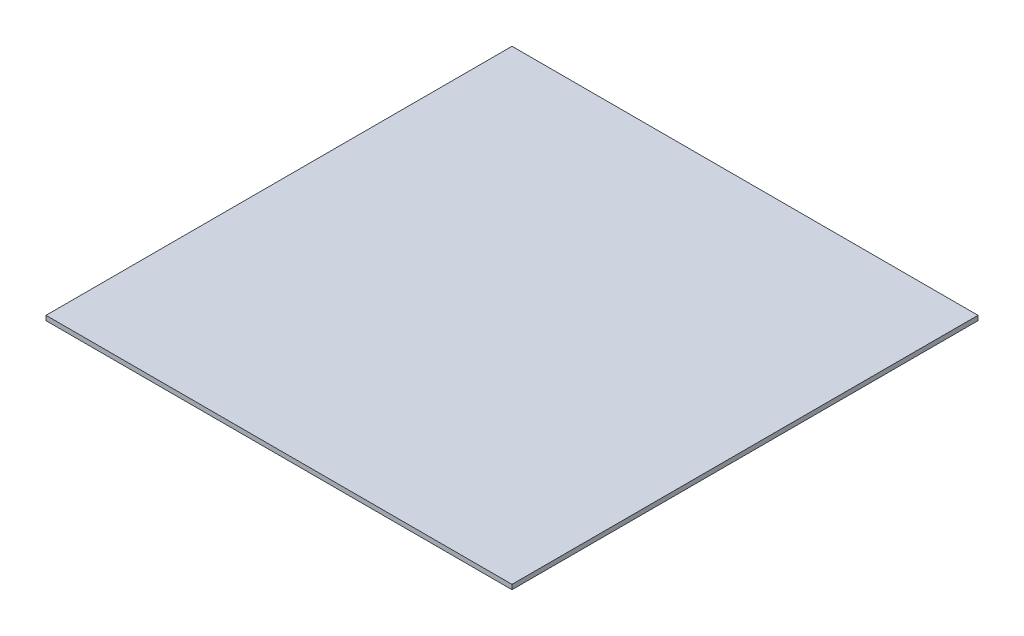
ISO-10303-21;
HEADER;
FILE_DESCRIPTION(('STEP AP214'),'2;1');
FILE_NAME('part.step','',(''),(''),'','','');
FILE_SCHEMA(('AUTOMOTIVE_DESIGN { 1 0 10303 214 1 1 1 1 }'));
ENDSEC;
DATA;
#1=APPLICATION_CONTEXT('core data for automotive mechanical design processes');
#2=APPLICATION_PROTOCOL_DEFINITION('international standard','automotive_design',2000,#1);
#3=PRODUCT_CONTEXT('',#1,'mechanical');
#4=PRODUCT('Part','Part','',(#3));
#5=PRODUCT_RELATED_PRODUCT_CATEGORY('part','',(#4));
#6=PRODUCT_DEFINITION_FORMATION('','',#4);
#7=PRODUCT_DEFINITION_CONTEXT('part definition',#1,'design');
#8=PRODUCT_DEFINITION('design','',#6,#7);
#9=PRODUCT_DEFINITION_SHAPE('','',#8);
#10=(LENGTH_UNIT() NAMED_UNIT(*) SI_UNIT(.MILLI.,.METRE.));
#11=(NAMED_UNIT(*) PLANE_ANGLE_UNIT() SI_UNIT($,.RADIAN.));
#12=(NAMED_UNIT(*) SI_UNIT($,.STERADIAN.) SOLID_ANGLE_UNIT());
#13=UNCERTAINTY_MEASURE_WITH_UNIT(LENGTH_MEASURE(1.E-05),#10,'distance_accuracy_value','');
#14=(GEOMETRIC_REPRESENTATION_CONTEXT(3) GLOBAL_UNCERTAINTY_ASSIGNED_CONTEXT((#13)) GLOBAL_UNIT_ASSIGNED_CONTEXT((#10,
#11,#12)) REPRESENTATION_CONTEXT('',''));
#15=CARTESIAN_POINT('',(0.,0.,0.));
#16=DIRECTION('',(0.,0.,1.));
#17=DIRECTION('',(1.,0.,0.));
#18=AXIS2_PLACEMENT_3D('',#15,#16,#17);
#19=CARTESIAN_POINT('',(50.,1.,50.));
#20=DIRECTION('',(-1.,0.,0.));
#21=DIRECTION('',(0.,0.,1.));
#22=AXIS2_PLACEMENT_3D('',#19,#20,#21);
#23=PLANE('',#22);
#24=DIRECTION('',(0.,0.,-1.));
#25=VECTOR('',#24,1.);
#26=CARTESIAN_POINT('',(50.,0.,50.));
#27=LINE('',#26,#25);
#28=CARTESIAN_POINT('',(50.,0.,50.));
#29=VERTEX_POINT('',#28);
#30=CARTESIAN_POINT('',(50.,0.,-50.));
#31=VERTEX_POINT('',#30);
#32=EDGE_CURVE('E102',#29,#31,#27,.T.);
#33=ORIENTED_EDGE('',*,*,#32,.T.);
#34=DIRECTION('',(0.,-1.,0.));
#35=VECTOR('',#34,1.);
#36=CARTESIAN_POINT('',(50.,1.,-50.));
#37=LINE('',#36,#35);
#38=CARTESIAN_POINT('',(50.,1.,-50.));
#39=VERTEX_POINT('',#38);
#40=EDGE_CURVE('E11',#39,#31,#37,.T.);
#41=ORIENTED_EDGE('',*,*,#40,.F.);
#42=DIRECTION('',(0.,0.,-1.));
#43=VECTOR('',#42,1.);
#44=CARTESIAN_POINT('',(50.,1.,50.));
#45=LINE('',#44,#43);
#46=CARTESIAN_POINT('',(50.,1.,50.));
#47=VERTEX_POINT('',#46);
#48=EDGE_CURVE('E90',#47,#39,#45,.T.);
#49=ORIENTED_EDGE('',*,*,#48,.F.);
#50=DIRECTION('',(0.,-1.,0.));
#51=VECTOR('',#50,1.);
#52=CARTESIAN_POINT('',(50.,1.,50.));
#53=LINE('',#52,#51);
#54=EDGE_CURVE('E98',#47,#29,#53,.T.);
#55=ORIENTED_EDGE('',*,*,#54,.T.);
#56=EDGE_LOOP('',(#33,#41,#49,#55));
#57=FACE_BOUND('',#56,.T.);
#58=ADVANCED_FACE('F39',(#57),#23,.F.);
#59=CARTESIAN_POINT('',(-50.,1.,-50.));
#60=DIRECTION('',(0.,0.,1.));
#61=DIRECTION('',(1.,0.,0.));
#62=AXIS2_PLACEMENT_3D('',#59,#60,#61);
#63=PLANE('',#62);
#64=DIRECTION('',(-1.,0.,0.));
#65=VECTOR('',#64,1.);
#66=CARTESIAN_POINT('',(-50.,0.,-50.));
#67=LINE('',#66,#65);
#68=CARTESIAN_POINT('',(-50.,0.,-50.));
#69=VERTEX_POINT('',#68);
#70=EDGE_CURVE('E94',#31,#69,#67,.T.);
#71=ORIENTED_EDGE('',*,*,#70,.T.);
#72=DIRECTION('',(0.,-1.,0.));
#73=VECTOR('',#72,1.);
#74=CARTESIAN_POINT('',(-50.,1.,-50.));
#75=LINE('',#74,#73);
#76=CARTESIAN_POINT('',(-50.,1.,-50.));
#77=VERTEX_POINT('',#76);
#78=EDGE_CURVE('E47',#77,#69,#75,.T.);
#79=ORIENTED_EDGE('',*,*,#78,.F.);
#80=DIRECTION('',(-1.,0.,0.));
#81=VECTOR('',#80,1.);
#82=CARTESIAN_POINT('',(-50.,1.,-50.));
#83=LINE('',#82,#81);
#84=EDGE_CURVE('E85',#39,#77,#83,.T.);
#85=ORIENTED_EDGE('',*,*,#84,.F.);
#86=ORIENTED_EDGE('',*,*,#40,.T.);
#87=EDGE_LOOP('',(#71,#79,#85,#86));
#88=FACE_BOUND('',#87,.T.);
#89=ADVANCED_FACE('F93',(#88),#63,.F.);
#90=CARTESIAN_POINT('',(-50.,1.,50.));
#91=DIRECTION('',(1.,0.,0.));
#92=DIRECTION('',(0.,0.,-1.));
#93=AXIS2_PLACEMENT_3D('',#90,#91,#92);
#94=PLANE('',#93);
#95=DIRECTION('',(0.,0.,1.));
#96=VECTOR('',#95,1.);
#97=CARTESIAN_POINT('',(-50.,0.,50.));
#98=LINE('',#97,#96);
#99=CARTESIAN_POINT('',(-50.,0.,50.));
#100=VERTEX_POINT('',#99);
#101=EDGE_CURVE('E72',#69,#100,#98,.T.);
#102=ORIENTED_EDGE('',*,*,#101,.T.);
#103=DIRECTION('',(0.,-1.,0.));
#104=VECTOR('',#103,1.);
#105=CARTESIAN_POINT('',(-50.,1.,50.));
#106=LINE('',#105,#104);
#107=CARTESIAN_POINT('',(-50.,1.,50.));
#108=VERTEX_POINT('',#107);
#109=EDGE_CURVE('E95',#108,#100,#106,.T.);
#110=ORIENTED_EDGE('',*,*,#109,.F.);
#111=DIRECTION('',(0.,0.,1.));
#112=VECTOR('',#111,1.);
#113=CARTESIAN_POINT('',(-50.,1.,50.));
#114=LINE('',#113,#112);
#115=EDGE_CURVE('E88',#77,#108,#114,.T.);
#116=ORIENTED_EDGE('',*,*,#115,.F.);
#117=ORIENTED_EDGE('',*,*,#78,.T.);
#118=EDGE_LOOP('',(#102,#110,#116,#117));
#119=FACE_BOUND('',#118,.T.);
#120=ADVANCED_FACE('F96',(#119),#94,.F.);
#121=CARTESIAN_POINT('',(-50.,1.,50.));
#122=DIRECTION('',(0.,0.,-1.));
#123=DIRECTION('',(-1.,0.,0.));
#124=AXIS2_PLACEMENT_3D('',#121,#122,#123);
#125=PLANE('',#124);
#126=DIRECTION('',(1.,0.,0.));
#127=VECTOR('',#126,1.);
#128=CARTESIAN_POINT('',(-50.,0.,50.));
#129=LINE('',#128,#127);
#130=EDGE_CURVE('E78',#100,#29,#129,.T.);
#131=ORIENTED_EDGE('',*,*,#130,.T.);
#132=ORIENTED_EDGE('',*,*,#54,.F.);
#133=DIRECTION('',(1.,0.,0.));
#134=VECTOR('',#133,1.);
#135=CARTESIAN_POINT('',(-50.,1.,50.));
#136=LINE('',#135,#134);
#137=EDGE_CURVE('E55',#108,#47,#136,.T.);
#138=ORIENTED_EDGE('',*,*,#137,.F.);
#139=ORIENTED_EDGE('',*,*,#109,.T.);
#140=EDGE_LOOP('',(#131,#132,#138,#139));
#141=FACE_BOUND('',#140,.T.);
#142=ADVANCED_FACE('F109',(#141),#125,.F.);
#143=CARTESIAN_POINT('',(0.,1.,0.));
#144=DIRECTION('',(0.,-1.,0.));
#145=DIRECTION('',(0.,0.,-1.));
#146=AXIS2_PLACEMENT_3D('',#143,#144,#145);
#147=PLANE('',#146);
#148=ORIENTED_EDGE('',*,*,#48,.T.);
#149=ORIENTED_EDGE('',*,*,#84,.T.);
#150=ORIENTED_EDGE('',*,*,#115,.T.);
#151=ORIENTED_EDGE('',*,*,#137,.T.);
#152=EDGE_LOOP('',(#148,#149,#150,#151));
#153=FACE_BOUND('',#152,.T.);
#154=ADVANCED_FACE('F86',(#153),#147,.F.);
#155=CARTESIAN_POINT('',(0.,0.,0.));
#156=DIRECTION('',(0.,-1.,0.));
#157=DIRECTION('',(0.,0.,-1.));
#158=AXIS2_PLACEMENT_3D('',#155,#156,#157);
#159=PLANE('',#158);
#160=ORIENTED_EDGE('',*,*,#32,.F.);
#161=ORIENTED_EDGE('',*,*,#130,.F.);
#162=ORIENTED_EDGE('',*,*,#101,.F.);
#163=ORIENTED_EDGE('',*,*,#70,.F.);
#164=EDGE_LOOP('',(#160,#161,#162,#163));
#165=FACE_BOUND('',#164,.T.);
#166=ADVANCED_FACE('F112',(#165),#159,.T.);
#167=CLOSED_SHELL('',(#58,#89,#120,#142,#154,#166));
#168=MANIFOLD_SOLID_BREP('B2',#167);
#169=ADVANCED_BREP_SHAPE_REPRESENTATION('',(#18,#168),#14);
#170=SHAPE_DEFINITION_REPRESENTATION(#9,#169);
ENDSEC;
END-ISO-10303-21;
